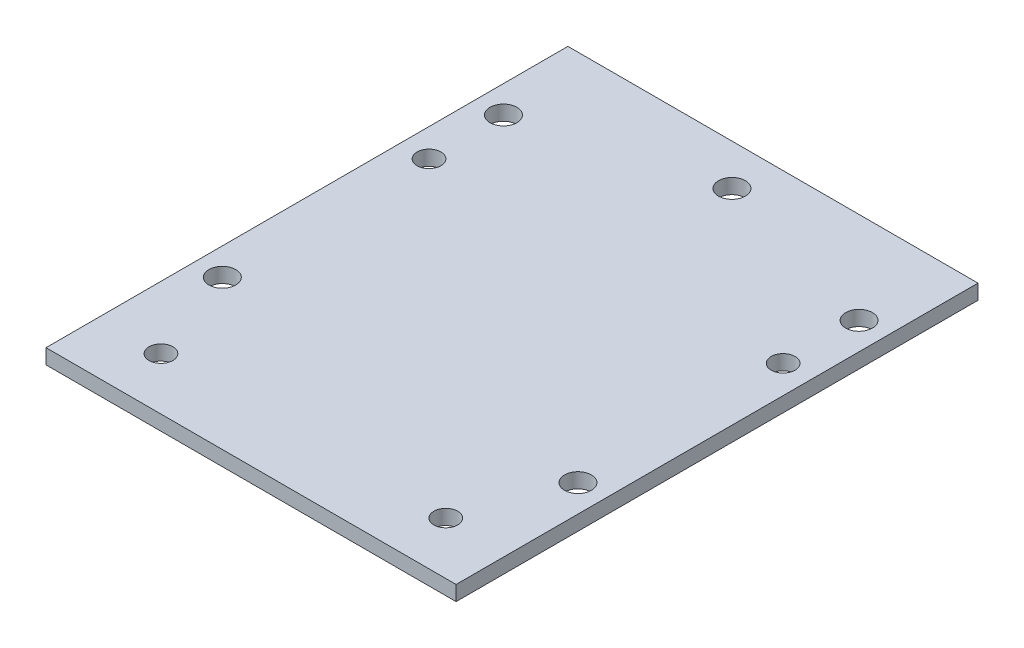
ISO-10303-21;
HEADER;
FILE_DESCRIPTION(('STEP AP214'),'2;1');
FILE_NAME('part.step','',(''),(''),'','','');
FILE_SCHEMA(('AUTOMOTIVE_DESIGN { 1 0 10303 214 1 1 1 1 }'));
ENDSEC;
DATA;
#1=APPLICATION_CONTEXT('core data for automotive mechanical design processes');
#2=APPLICATION_PROTOCOL_DEFINITION('international standard','automotive_design',2000,#1);
#3=PRODUCT_CONTEXT('',#1,'mechanical');
#4=PRODUCT('Part','Part','',(#3));
#5=PRODUCT_RELATED_PRODUCT_CATEGORY('part','',(#4));
#6=PRODUCT_DEFINITION_FORMATION('','',#4);
#7=PRODUCT_DEFINITION_CONTEXT('part definition',#1,'design');
#8=PRODUCT_DEFINITION('design','',#6,#7);
#9=PRODUCT_DEFINITION_SHAPE('','',#8);
#10=(LENGTH_UNIT() NAMED_UNIT(*) SI_UNIT(.MILLI.,.METRE.));
#11=(NAMED_UNIT(*) PLANE_ANGLE_UNIT() SI_UNIT($,.RADIAN.));
#12=(NAMED_UNIT(*) SI_UNIT($,.STERADIAN.) SOLID_ANGLE_UNIT());
#13=UNCERTAINTY_MEASURE_WITH_UNIT(LENGTH_MEASURE(1.E-05),#10,'distance_accuracy_value','');
#14=(GEOMETRIC_REPRESENTATION_CONTEXT(3) GLOBAL_UNCERTAINTY_ASSIGNED_CONTEXT((#13)) GLOBAL_UNIT_ASSIGNED_CONTEXT((#10,
#11,#12)) REPRESENTATION_CONTEXT('',''));
#15=CARTESIAN_POINT('',(0.,0.,0.));
#16=DIRECTION('',(0.,0.,1.));
#17=DIRECTION('',(1.,0.,0.));
#18=AXIS2_PLACEMENT_3D('',#15,#16,#17);
#19=CARTESIAN_POINT('',(0.,2.,0.));
#20=DIRECTION('',(0.,1.,0.));
#21=DIRECTION('',(0.,0.,1.));
#22=AXIS2_PLACEMENT_3D('',#19,#20,#21);
#23=PLANE('',#22);
#24=CARTESIAN_POINT('',(-23.3553956834532,2.,-16.2881294964029));
#25=DIRECTION('',(0.,1.,0.));
#26=DIRECTION('',(0.,0.,1.));
#27=AXIS2_PLACEMENT_3D('',#24,#25,#26);
#28=CIRCLE('',#27,1.8);
#29=CARTESIAN_POINT('',(-23.3553956834532,2.,-14.4881294964029));
#30=VERTEX_POINT('',#29);
#31=EDGE_CURVE('E187',#30,#30,#28,.T.);
#32=ORIENTED_EDGE('',*,*,#31,.F.);
#33=EDGE_LOOP('',(#32));
#34=FACE_BOUND('',#33,.T.);
#35=CARTESIAN_POINT('',(-23.3553956834532,2.,21.4118705035971));
#36=DIRECTION('',(0.,1.,0.));
#37=DIRECTION('',(0.,0.,1.));
#38=AXIS2_PLACEMENT_3D('',#35,#36,#37);
#39=CIRCLE('',#38,1.8);
#40=CARTESIAN_POINT('',(-23.3553956834532,2.,23.2118705035971));
#41=VERTEX_POINT('',#40);
#42=EDGE_CURVE('E171',#41,#41,#39,.T.);
#43=ORIENTED_EDGE('',*,*,#42,.F.);
#44=EDGE_LOOP('',(#43));
#45=FACE_BOUND('',#44,.T.);
#46=CARTESIAN_POINT('',(-23.2553956834532,2.,-6.20513617722127));
#47=DIRECTION('',(0.,1.,0.));
#48=DIRECTION('',(0.,0.,1.));
#49=AXIS2_PLACEMENT_3D('',#46,#47,#48);
#50=CIRCLE('',#49,1.6);
#51=CARTESIAN_POINT('',(-23.2553956834532,2.,-4.60513617722127));
#52=VERTEX_POINT('',#51);
#53=EDGE_CURVE('E155',#52,#52,#50,.T.);
#54=ORIENTED_EDGE('',*,*,#53,.F.);
#55=EDGE_LOOP('',(#54));
#56=FACE_BOUND('',#55,.T.);
#57=CARTESIAN_POINT('',(-18.6053956834532,2.,34.3948638227787));
#58=DIRECTION('',(0.,1.,0.));
#59=DIRECTION('',(0.,0.,1.));
#60=AXIS2_PLACEMENT_3D('',#57,#58,#59);
#61=CIRCLE('',#60,1.6);
#62=CARTESIAN_POINT('',(-18.6053956834532,2.,35.9948638227787));
#63=VERTEX_POINT('',#62);
#64=EDGE_CURVE('E139',#63,#63,#61,.T.);
#65=ORIENTED_EDGE('',*,*,#64,.F.);
#66=EDGE_LOOP('',(#65));
#67=FACE_BOUND('',#66,.T.);
#68=DIRECTION('',(0.,0.,1.));
#69=VECTOR('',#68,1.);
#70=CARTESIAN_POINT('',(-27.0053956834532,2.,-28.5881294964029));
#71=LINE('',#70,#69);
#72=CARTESIAN_POINT('',(-27.0053956834532,2.,-28.5881294964029));
#73=VERTEX_POINT('',#72);
#74=CARTESIAN_POINT('',(-27.0053956834532,2.,41.4118705035971));
#75=VERTEX_POINT('',#74);
#76=EDGE_CURVE('E94',#73,#75,#71,.T.);
#77=ORIENTED_EDGE('',*,*,#76,.T.);
#78=DIRECTION('',(1.,0.,0.));
#79=VECTOR('',#78,1.);
#80=CARTESIAN_POINT('',(-27.0053956834532,2.,41.4118705035971));
#81=LINE('',#80,#79);
#82=CARTESIAN_POINT('',(27.9946043165468,2.,41.4118705035971));
#83=VERTEX_POINT('',#82);
#84=EDGE_CURVE('E89',#75,#83,#81,.T.);
#85=ORIENTED_EDGE('',*,*,#84,.T.);
#86=DIRECTION('',(0.,0.,-1.));
#87=VECTOR('',#86,1.);
#88=CARTESIAN_POINT('',(27.9946043165468,2.,-28.5881294964029));
#89=LINE('',#88,#87);
#90=CARTESIAN_POINT('',(27.9946043165468,2.,-28.5881294964029));
#91=VERTEX_POINT('',#90);
#92=EDGE_CURVE('E92',#83,#91,#89,.T.);
#93=ORIENTED_EDGE('',*,*,#92,.T.);
#94=DIRECTION('',(-1.,0.,0.));
#95=VECTOR('',#94,1.);
#96=CARTESIAN_POINT('',(-27.0053956834532,2.,-28.5881294964029));
#97=LINE('',#96,#95);
#98=EDGE_CURVE('E59',#91,#73,#97,.T.);
#99=ORIENTED_EDGE('',*,*,#98,.T.);
#100=EDGE_LOOP('',(#77,#85,#93,#99));
#101=FACE_BOUND('',#100,.T.);
#102=CARTESIAN_POINT('',(19.5946043165468,2.,34.3948638227787));
#103=DIRECTION('',(0.,1.,0.));
#104=DIRECTION('',(0.,0.,1.));
#105=AXIS2_PLACEMENT_3D('',#102,#103,#104);
#106=CIRCLE('',#105,1.6);
#107=CARTESIAN_POINT('',(19.5946043165468,2.,35.9948638227787));
#108=VERTEX_POINT('',#107);
#109=EDGE_CURVE('E115',#108,#108,#106,.T.);
#110=ORIENTED_EDGE('',*,*,#109,.F.);
#111=EDGE_LOOP('',(#110));
#112=FACE_BOUND('',#111,.T.);
#113=CARTESIAN_POINT('',(24.2446043165468,2.,-6.20513617722127));
#114=DIRECTION('',(0.,1.,0.));
#115=DIRECTION('',(0.,0.,1.));
#116=AXIS2_PLACEMENT_3D('',#113,#114,#115);
#117=CIRCLE('',#116,1.6);
#118=CARTESIAN_POINT('',(24.2446043165468,2.,-4.60513617722127));
#119=VERTEX_POINT('',#118);
#120=EDGE_CURVE('E147',#119,#119,#117,.T.);
#121=ORIENTED_EDGE('',*,*,#120,.F.);
#122=EDGE_LOOP('',(#121));
#123=FACE_BOUND('',#122,.T.);
#124=CARTESIAN_POINT('',(24.3446043165468,2.,21.4118705035971));
#125=DIRECTION('',(0.,1.,0.));
#126=DIRECTION('',(0.,0.,1.));
#127=AXIS2_PLACEMENT_3D('',#124,#125,#126);
#128=CIRCLE('',#127,1.80000000000001);
#129=CARTESIAN_POINT('',(24.3446043165468,2.,23.2118705035971));
#130=VERTEX_POINT('',#129);
#131=EDGE_CURVE('E163',#130,#130,#128,.T.);
#132=ORIENTED_EDGE('',*,*,#131,.F.);
#133=EDGE_LOOP('',(#132));
#134=FACE_BOUND('',#133,.T.);
#135=CARTESIAN_POINT('',(24.3446043165468,2.,-16.2881294964029));
#136=DIRECTION('',(0.,1.,0.));
#137=DIRECTION('',(0.,0.,1.));
#138=AXIS2_PLACEMENT_3D('',#135,#136,#137);
#139=CIRCLE('',#138,1.8);
#140=CARTESIAN_POINT('',(24.3446043165468,2.,-14.4881294964029));
#141=VERTEX_POINT('',#140);
#142=EDGE_CURVE('E179',#141,#141,#139,.T.);
#143=ORIENTED_EDGE('',*,*,#142,.F.);
#144=EDGE_LOOP('',(#143));
#145=FACE_BOUND('',#144,.T.);
#146=CARTESIAN_POINT('',(0.494604316546764,2.,-23.0864748833334));
#147=DIRECTION('',(0.,1.,0.));
#148=DIRECTION('',(0.,0.,1.));
#149=AXIS2_PLACEMENT_3D('',#146,#147,#148);
#150=CIRCLE('',#149,1.8);
#151=CARTESIAN_POINT('',(0.494604316546764,2.,-21.2864748833334));
#152=VERTEX_POINT('',#151);
#153=EDGE_CURVE('E195',#152,#152,#150,.T.);
#154=ORIENTED_EDGE('',*,*,#153,.F.);
#155=EDGE_LOOP('',(#154));
#156=FACE_BOUND('',#155,.T.);
#157=ADVANCED_FACE('F41',(#34,#45,#56,#67,#101,#112,#123,#134,#145,#156),#23,.T.);
#158=CARTESIAN_POINT('',(0.,0.,0.));
#159=DIRECTION('',(0.,1.,0.));
#160=DIRECTION('',(0.,0.,1.));
#161=AXIS2_PLACEMENT_3D('',#158,#159,#160);
#162=PLANE('',#161);
#163=DIRECTION('',(0.,0.,1.));
#164=VECTOR('',#163,1.);
#165=CARTESIAN_POINT('',(-27.0053956834532,0.,-28.5881294964029));
#166=LINE('',#165,#164);
#167=CARTESIAN_POINT('',(-27.0053956834532,0.,-28.5881294964029));
#168=VERTEX_POINT('',#167);
#169=CARTESIAN_POINT('',(-27.0053956834532,0.,41.4118705035971));
#170=VERTEX_POINT('',#169);
#171=EDGE_CURVE('E111',#168,#170,#166,.T.);
#172=ORIENTED_EDGE('',*,*,#171,.F.);
#173=DIRECTION('',(-1.,0.,0.));
#174=VECTOR('',#173,1.);
#175=CARTESIAN_POINT('',(-27.0053956834532,0.,-28.5881294964029));
#176=LINE('',#175,#174);
#177=CARTESIAN_POINT('',(27.9946043165468,0.,-28.5881294964029));
#178=VERTEX_POINT('',#177);
#179=EDGE_CURVE('E82',#178,#168,#176,.T.);
#180=ORIENTED_EDGE('',*,*,#179,.F.);
#181=DIRECTION('',(0.,0.,-1.));
#182=VECTOR('',#181,1.);
#183=CARTESIAN_POINT('',(27.9946043165468,0.,-28.5881294964029));
#184=LINE('',#183,#182);
#185=CARTESIAN_POINT('',(27.9946043165468,0.,41.4118705035971));
#186=VERTEX_POINT('',#185);
#187=EDGE_CURVE('E76',#186,#178,#184,.T.);
#188=ORIENTED_EDGE('',*,*,#187,.F.);
#189=DIRECTION('',(1.,0.,0.));
#190=VECTOR('',#189,1.);
#191=CARTESIAN_POINT('',(-27.0053956834532,0.,41.4118705035971));
#192=LINE('',#191,#190);
#193=EDGE_CURVE('E99',#170,#186,#192,.T.);
#194=ORIENTED_EDGE('',*,*,#193,.F.);
#195=EDGE_LOOP('',(#172,#180,#188,#194));
#196=FACE_BOUND('',#195,.T.);
#197=CARTESIAN_POINT('',(19.5946043165468,0.,34.3948638227787));
#198=DIRECTION('',(0.,1.,0.));
#199=DIRECTION('',(0.,0.,1.));
#200=AXIS2_PLACEMENT_3D('',#197,#198,#199);
#201=CIRCLE('',#200,1.6);
#202=CARTESIAN_POINT('',(19.5946043165468,0.,35.9948638227787));
#203=VERTEX_POINT('',#202);
#204=EDGE_CURVE('E135',#203,#203,#201,.T.);
#205=ORIENTED_EDGE('',*,*,#204,.T.);
#206=EDGE_LOOP('',(#205));
#207=FACE_BOUND('',#206,.T.);
#208=CARTESIAN_POINT('',(-18.6053956834532,0.,34.3948638227787));
#209=DIRECTION('',(0.,1.,0.));
#210=DIRECTION('',(0.,0.,1.));
#211=AXIS2_PLACEMENT_3D('',#208,#209,#210);
#212=CIRCLE('',#211,1.6);
#213=CARTESIAN_POINT('',(-18.6053956834532,0.,35.9948638227787));
#214=VERTEX_POINT('',#213);
#215=EDGE_CURVE('E143',#214,#214,#212,.T.);
#216=ORIENTED_EDGE('',*,*,#215,.T.);
#217=EDGE_LOOP('',(#216));
#218=FACE_BOUND('',#217,.T.);
#219=CARTESIAN_POINT('',(24.2446043165468,0.,-6.20513617722127));
#220=DIRECTION('',(0.,1.,0.));
#221=DIRECTION('',(0.,0.,1.));
#222=AXIS2_PLACEMENT_3D('',#219,#220,#221);
#223=CIRCLE('',#222,1.6);
#224=CARTESIAN_POINT('',(24.2446043165468,0.,-4.60513617722127));
#225=VERTEX_POINT('',#224);
#226=EDGE_CURVE('E151',#225,#225,#223,.T.);
#227=ORIENTED_EDGE('',*,*,#226,.T.);
#228=EDGE_LOOP('',(#227));
#229=FACE_BOUND('',#228,.T.);
#230=CARTESIAN_POINT('',(-23.2553956834532,0.,-6.20513617722127));
#231=DIRECTION('',(0.,1.,0.));
#232=DIRECTION('',(0.,0.,1.));
#233=AXIS2_PLACEMENT_3D('',#230,#231,#232);
#234=CIRCLE('',#233,1.6);
#235=CARTESIAN_POINT('',(-23.2553956834532,0.,-4.60513617722127));
#236=VERTEX_POINT('',#235);
#237=EDGE_CURVE('E159',#236,#236,#234,.T.);
#238=ORIENTED_EDGE('',*,*,#237,.T.);
#239=EDGE_LOOP('',(#238));
#240=FACE_BOUND('',#239,.T.);
#241=CARTESIAN_POINT('',(24.3446043165468,0.,21.4118705035971));
#242=DIRECTION('',(0.,1.,0.));
#243=DIRECTION('',(0.,0.,1.));
#244=AXIS2_PLACEMENT_3D('',#241,#242,#243);
#245=CIRCLE('',#244,1.80000000000001);
#246=CARTESIAN_POINT('',(24.3446043165468,0.,23.2118705035971));
#247=VERTEX_POINT('',#246);
#248=EDGE_CURVE('E167',#247,#247,#245,.T.);
#249=ORIENTED_EDGE('',*,*,#248,.T.);
#250=EDGE_LOOP('',(#249));
#251=FACE_BOUND('',#250,.T.);
#252=CARTESIAN_POINT('',(-23.3553956834532,0.,21.4118705035971));
#253=DIRECTION('',(0.,1.,0.));
#254=DIRECTION('',(0.,0.,1.));
#255=AXIS2_PLACEMENT_3D('',#252,#253,#254);
#256=CIRCLE('',#255,1.8);
#257=CARTESIAN_POINT('',(-23.3553956834532,0.,23.2118705035971));
#258=VERTEX_POINT('',#257);
#259=EDGE_CURVE('E175',#258,#258,#256,.T.);
#260=ORIENTED_EDGE('',*,*,#259,.T.);
#261=EDGE_LOOP('',(#260));
#262=FACE_BOUND('',#261,.T.);
#263=CARTESIAN_POINT('',(24.3446043165468,0.,-16.2881294964029));
#264=DIRECTION('',(0.,1.,0.));
#265=DIRECTION('',(0.,0.,1.));
#266=AXIS2_PLACEMENT_3D('',#263,#264,#265);
#267=CIRCLE('',#266,1.8);
#268=CARTESIAN_POINT('',(24.3446043165468,0.,-14.4881294964029));
#269=VERTEX_POINT('',#268);
#270=EDGE_CURVE('E183',#269,#269,#267,.T.);
#271=ORIENTED_EDGE('',*,*,#270,.T.);
#272=EDGE_LOOP('',(#271));
#273=FACE_BOUND('',#272,.T.);
#274=CARTESIAN_POINT('',(-23.3553956834532,0.,-16.2881294964029));
#275=DIRECTION('',(0.,1.,0.));
#276=DIRECTION('',(0.,0.,1.));
#277=AXIS2_PLACEMENT_3D('',#274,#275,#276);
#278=CIRCLE('',#277,1.8);
#279=CARTESIAN_POINT('',(-23.3553956834532,0.,-14.4881294964029));
#280=VERTEX_POINT('',#279);
#281=EDGE_CURVE('E191',#280,#280,#278,.T.);
#282=ORIENTED_EDGE('',*,*,#281,.T.);
#283=EDGE_LOOP('',(#282));
#284=FACE_BOUND('',#283,.T.);
#285=CARTESIAN_POINT('',(0.494604316546764,0.,-23.0864748833334));
#286=DIRECTION('',(0.,1.,0.));
#287=DIRECTION('',(0.,0.,1.));
#288=AXIS2_PLACEMENT_3D('',#285,#286,#287);
#289=CIRCLE('',#288,1.8);
#290=CARTESIAN_POINT('',(0.494604316546764,0.,-21.2864748833334));
#291=VERTEX_POINT('',#290);
#292=EDGE_CURVE('E199',#291,#291,#289,.T.);
#293=ORIENTED_EDGE('',*,*,#292,.T.);
#294=EDGE_LOOP('',(#293));
#295=FACE_BOUND('',#294,.T.);
#296=ADVANCED_FACE('F129',(#196,#207,#218,#229,#240,#251,#262,#273,#284,#295),#162,.F.);
#297=CARTESIAN_POINT('',(-27.0053956834532,2.,-28.5881294964029));
#298=DIRECTION('',(1.,0.,0.));
#299=DIRECTION('',(0.,0.,-1.));
#300=AXIS2_PLACEMENT_3D('',#297,#298,#299);
#301=PLANE('',#300);
#302=ORIENTED_EDGE('',*,*,#171,.T.);
#303=DIRECTION('',(0.,-1.,0.));
#304=VECTOR('',#303,1.);
#305=CARTESIAN_POINT('',(-27.0053956834532,2.,41.4118705035971));
#306=LINE('',#305,#304);
#307=EDGE_CURVE('E11',#75,#170,#306,.T.);
#308=ORIENTED_EDGE('',*,*,#307,.F.);
#309=ORIENTED_EDGE('',*,*,#76,.F.);
#310=DIRECTION('',(0.,-1.,0.));
#311=VECTOR('',#310,1.);
#312=CARTESIAN_POINT('',(-27.0053956834532,2.,-28.5881294964029));
#313=LINE('',#312,#311);
#314=EDGE_CURVE('E107',#73,#168,#313,.T.);
#315=ORIENTED_EDGE('',*,*,#314,.T.);
#316=EDGE_LOOP('',(#302,#308,#309,#315));
#317=FACE_BOUND('',#316,.T.);
#318=ADVANCED_FACE('F43',(#317),#301,.F.);
#319=CARTESIAN_POINT('',(-27.0053956834532,2.,41.4118705035971));
#320=DIRECTION('',(0.,0.,-1.));
#321=DIRECTION('',(-1.,0.,0.));
#322=AXIS2_PLACEMENT_3D('',#319,#320,#321);
#323=PLANE('',#322);
#324=ORIENTED_EDGE('',*,*,#193,.T.);
#325=DIRECTION('',(0.,-1.,0.));
#326=VECTOR('',#325,1.);
#327=CARTESIAN_POINT('',(27.9946043165468,2.,41.4118705035971));
#328=LINE('',#327,#326);
#329=EDGE_CURVE('E51',#83,#186,#328,.T.);
#330=ORIENTED_EDGE('',*,*,#329,.F.);
#331=ORIENTED_EDGE('',*,*,#84,.F.);
#332=ORIENTED_EDGE('',*,*,#307,.T.);
#333=EDGE_LOOP('',(#324,#330,#331,#332));
#334=FACE_BOUND('',#333,.T.);
#335=ADVANCED_FACE('F98',(#334),#323,.F.);
#336=CARTESIAN_POINT('',(27.9946043165468,2.,-28.5881294964029));
#337=DIRECTION('',(-1.,0.,0.));
#338=DIRECTION('',(0.,0.,1.));
#339=AXIS2_PLACEMENT_3D('',#336,#337,#338);
#340=PLANE('',#339);
#341=ORIENTED_EDGE('',*,*,#187,.T.);
#342=DIRECTION('',(0.,-1.,0.));
#343=VECTOR('',#342,1.);
#344=CARTESIAN_POINT('',(27.9946043165468,2.,-28.5881294964029));
#345=LINE('',#344,#343);
#346=EDGE_CURVE('E101',#91,#178,#345,.T.);
#347=ORIENTED_EDGE('',*,*,#346,.F.);
#348=ORIENTED_EDGE('',*,*,#92,.F.);
#349=ORIENTED_EDGE('',*,*,#329,.T.);
#350=EDGE_LOOP('',(#341,#347,#348,#349));
#351=FACE_BOUND('',#350,.T.);
#352=ADVANCED_FACE('F102',(#351),#340,.F.);
#353=CARTESIAN_POINT('',(-27.0053956834532,2.,-28.5881294964029));
#354=DIRECTION('',(0.,0.,1.));
#355=DIRECTION('',(1.,0.,0.));
#356=AXIS2_PLACEMENT_3D('',#353,#354,#355);
#357=PLANE('',#356);
#358=ORIENTED_EDGE('',*,*,#179,.T.);
#359=ORIENTED_EDGE('',*,*,#314,.F.);
#360=ORIENTED_EDGE('',*,*,#98,.F.);
#361=ORIENTED_EDGE('',*,*,#346,.T.);
#362=EDGE_LOOP('',(#358,#359,#360,#361));
#363=FACE_BOUND('',#362,.T.);
#364=ADVANCED_FACE('F126',(#363),#357,.F.);
#365=CARTESIAN_POINT('',(19.5946043165468,2.,34.3948638227787));
#366=DIRECTION('',(0.,-1.,0.));
#367=DIRECTION('',(0.,0.,-1.));
#368=AXIS2_PLACEMENT_3D('',#365,#366,#367);
#369=CYLINDRICAL_SURFACE('',#368,1.6);
#370=ORIENTED_EDGE('',*,*,#109,.T.);
#371=EDGE_LOOP('',(#370));
#372=FACE_BOUND('',#371,.T.);
#373=ORIENTED_EDGE('',*,*,#204,.F.);
#374=EDGE_LOOP('',(#373));
#375=FACE_BOUND('',#374,.T.);
#376=ADVANCED_FACE('F221',(#372,#375),#369,.F.);
#377=CARTESIAN_POINT('',(-18.6053956834532,2.,34.3948638227787));
#378=DIRECTION('',(0.,-1.,0.));
#379=DIRECTION('',(0.,0.,-1.));
#380=AXIS2_PLACEMENT_3D('',#377,#378,#379);
#381=CYLINDRICAL_SURFACE('',#380,1.6);
#382=ORIENTED_EDGE('',*,*,#64,.T.);
#383=EDGE_LOOP('',(#382));
#384=FACE_BOUND('',#383,.T.);
#385=ORIENTED_EDGE('',*,*,#215,.F.);
#386=EDGE_LOOP('',(#385));
#387=FACE_BOUND('',#386,.T.);
#388=ADVANCED_FACE('F275',(#384,#387),#381,.F.);
#389=CARTESIAN_POINT('',(24.2446043165468,2.,-6.20513617722127));
#390=DIRECTION('',(0.,-1.,0.));
#391=DIRECTION('',(0.,0.,-1.));
#392=AXIS2_PLACEMENT_3D('',#389,#390,#391);
#393=CYLINDRICAL_SURFACE('',#392,1.6);
#394=ORIENTED_EDGE('',*,*,#120,.T.);
#395=EDGE_LOOP('',(#394));
#396=FACE_BOUND('',#395,.T.);
#397=ORIENTED_EDGE('',*,*,#226,.F.);
#398=EDGE_LOOP('',(#397));
#399=FACE_BOUND('',#398,.T.);
#400=ADVANCED_FACE('F284',(#396,#399),#393,.F.);
#401=CARTESIAN_POINT('',(-23.2553956834532,2.,-6.20513617722127));
#402=DIRECTION('',(0.,-1.,0.));
#403=DIRECTION('',(0.,0.,-1.));
#404=AXIS2_PLACEMENT_3D('',#401,#402,#403);
#405=CYLINDRICAL_SURFACE('',#404,1.6);
#406=ORIENTED_EDGE('',*,*,#53,.T.);
#407=EDGE_LOOP('',(#406));
#408=FACE_BOUND('',#407,.T.);
#409=ORIENTED_EDGE('',*,*,#237,.F.);
#410=EDGE_LOOP('',(#409));
#411=FACE_BOUND('',#410,.T.);
#412=ADVANCED_FACE('F293',(#408,#411),#405,.F.);
#413=CARTESIAN_POINT('',(24.3446043165468,2.,21.4118705035971));
#414=DIRECTION('',(0.,-1.,0.));
#415=DIRECTION('',(0.,0.,-1.));
#416=AXIS2_PLACEMENT_3D('',#413,#414,#415);
#417=CYLINDRICAL_SURFACE('',#416,1.80000000000001);
#418=ORIENTED_EDGE('',*,*,#131,.T.);
#419=EDGE_LOOP('',(#418));
#420=FACE_BOUND('',#419,.T.);
#421=ORIENTED_EDGE('',*,*,#248,.F.);
#422=EDGE_LOOP('',(#421));
#423=FACE_BOUND('',#422,.T.);
#424=ADVANCED_FACE('F303',(#420,#423),#417,.F.);
#425=CARTESIAN_POINT('',(-23.3553956834532,2.,21.4118705035971));
#426=DIRECTION('',(0.,-1.,0.));
#427=DIRECTION('',(0.,0.,-1.));
#428=AXIS2_PLACEMENT_3D('',#425,#426,#427);
#429=CYLINDRICAL_SURFACE('',#428,1.8);
#430=ORIENTED_EDGE('',*,*,#42,.T.);
#431=EDGE_LOOP('',(#430));
#432=FACE_BOUND('',#431,.T.);
#433=ORIENTED_EDGE('',*,*,#259,.F.);
#434=EDGE_LOOP('',(#433));
#435=FACE_BOUND('',#434,.T.);
#436=ADVANCED_FACE('F313',(#432,#435),#429,.F.);
#437=CARTESIAN_POINT('',(24.3446043165468,2.,-16.2881294964029));
#438=DIRECTION('',(0.,-1.,0.));
#439=DIRECTION('',(0.,0.,-1.));
#440=AXIS2_PLACEMENT_3D('',#437,#438,#439);
#441=CYLINDRICAL_SURFACE('',#440,1.8);
#442=ORIENTED_EDGE('',*,*,#142,.T.);
#443=EDGE_LOOP('',(#442));
#444=FACE_BOUND('',#443,.T.);
#445=ORIENTED_EDGE('',*,*,#270,.F.);
#446=EDGE_LOOP('',(#445));
#447=FACE_BOUND('',#446,.T.);
#448=ADVANCED_FACE('F323',(#444,#447),#441,.F.);
#449=CARTESIAN_POINT('',(-23.3553956834532,2.,-16.2881294964029));
#450=DIRECTION('',(0.,-1.,0.));
#451=DIRECTION('',(0.,0.,-1.));
#452=AXIS2_PLACEMENT_3D('',#449,#450,#451);
#453=CYLINDRICAL_SURFACE('',#452,1.8);
#454=ORIENTED_EDGE('',*,*,#31,.T.);
#455=EDGE_LOOP('',(#454));
#456=FACE_BOUND('',#455,.T.);
#457=ORIENTED_EDGE('',*,*,#281,.F.);
#458=EDGE_LOOP('',(#457));
#459=FACE_BOUND('',#458,.T.);
#460=ADVANCED_FACE('F333',(#456,#459),#453,.F.);
#461=CARTESIAN_POINT('',(0.494604316546764,2.,-23.0864748833334));
#462=DIRECTION('',(0.,-1.,0.));
#463=DIRECTION('',(0.,0.,-1.));
#464=AXIS2_PLACEMENT_3D('',#461,#462,#463);
#465=CYLINDRICAL_SURFACE('',#464,1.8);
#466=ORIENTED_EDGE('',*,*,#153,.T.);
#467=EDGE_LOOP('',(#466));
#468=FACE_BOUND('',#467,.T.);
#469=ORIENTED_EDGE('',*,*,#292,.F.);
#470=EDGE_LOOP('',(#469));
#471=FACE_BOUND('',#470,.T.);
#472=ADVANCED_FACE('F208',(#468,#471),#465,.F.);
#473=CLOSED_SHELL('',(#157,#296,#318,#335,#352,#364,#376,#388,#400,#412,#424,#436,#448,#460,#472));
#474=MANIFOLD_SOLID_BREP('B2',#473);
#475=ADVANCED_BREP_SHAPE_REPRESENTATION('',(#18,#474),#14);
#476=SHAPE_DEFINITION_REPRESENTATION(#9,#475);
ENDSEC;
END-ISO-10303-21;
